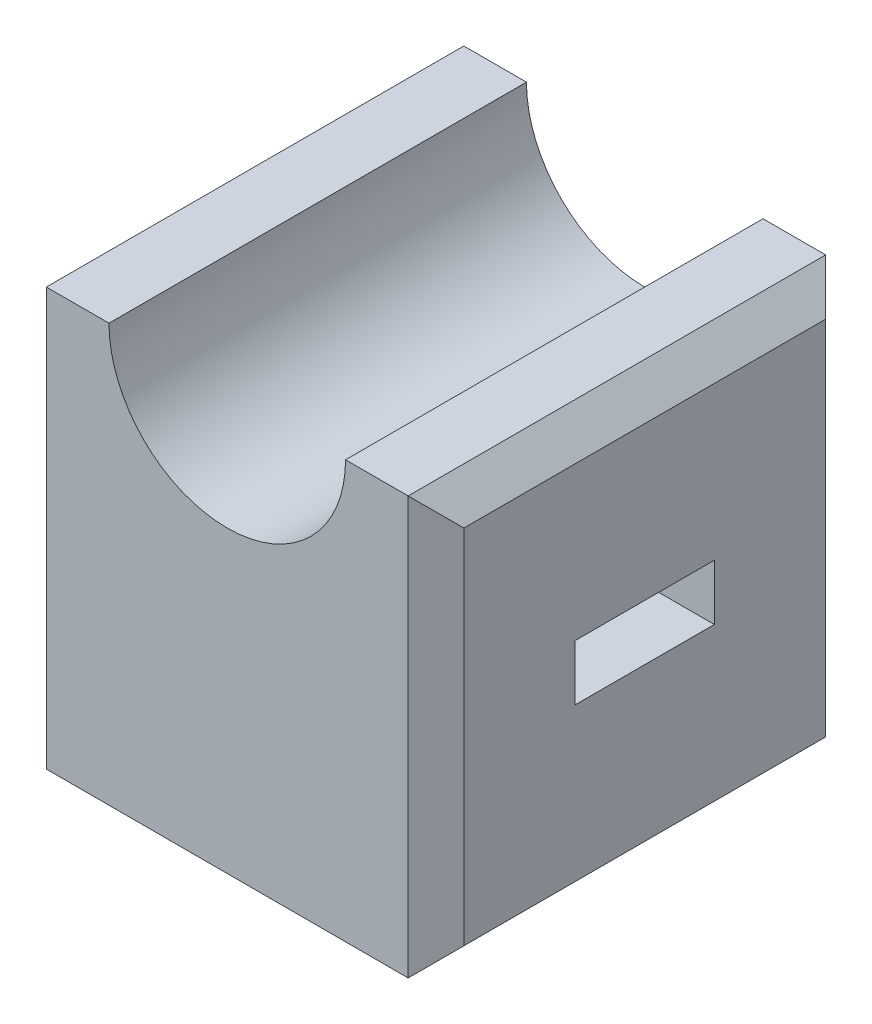
ISO-10303-21;
HEADER;
FILE_DESCRIPTION(('STEP AP214'),'2;1');
FILE_NAME('part.step','',(''),(''),'','','');
FILE_SCHEMA(('AUTOMOTIVE_DESIGN { 1 0 10303 214 1 1 1 1 }'));
ENDSEC;
DATA;
#1=APPLICATION_CONTEXT('core data for automotive mechanical design processes');
#2=APPLICATION_PROTOCOL_DEFINITION('international standard','automotive_design',2000,#1);
#3=PRODUCT_CONTEXT('',#1,'mechanical');
#4=PRODUCT('Part','Part','',(#3));
#5=PRODUCT_RELATED_PRODUCT_CATEGORY('part','',(#4));
#6=PRODUCT_DEFINITION_FORMATION('','',#4);
#7=PRODUCT_DEFINITION_CONTEXT('part definition',#1,'design');
#8=PRODUCT_DEFINITION('design','',#6,#7);
#9=PRODUCT_DEFINITION_SHAPE('','',#8);
#10=(LENGTH_UNIT() NAMED_UNIT(*) SI_UNIT(.MILLI.,.METRE.));
#11=(NAMED_UNIT(*) PLANE_ANGLE_UNIT() SI_UNIT($,.RADIAN.));
#12=(NAMED_UNIT(*) SI_UNIT($,.STERADIAN.) SOLID_ANGLE_UNIT());
#13=UNCERTAINTY_MEASURE_WITH_UNIT(LENGTH_MEASURE(1.E-05),#10,'distance_accuracy_value','');
#14=(GEOMETRIC_REPRESENTATION_CONTEXT(3) GLOBAL_UNCERTAINTY_ASSIGNED_CONTEXT((#13)) GLOBAL_UNIT_ASSIGNED_CONTEXT((#10,
#11,#12)) REPRESENTATION_CONTEXT('',''));
#15=CARTESIAN_POINT('',(0.,0.,0.));
#16=DIRECTION('',(0.,0.,1.));
#17=DIRECTION('',(1.,0.,0.));
#18=AXIS2_PLACEMENT_3D('',#15,#16,#17);
#19=CARTESIAN_POINT('',(15.,-15.,30.));
#20=DIRECTION('',(-1.,0.,0.));
#21=DIRECTION('',(0.,0.,1.));
#22=AXIS2_PLACEMENT_3D('',#19,#20,#21);
#23=PLANE('',#22);
#24=DIRECTION('',(0.,0.,1.));
#25=VECTOR('',#24,1.);
#26=CARTESIAN_POINT('',(15.,2.,20.));
#27=LINE('',#26,#25);
#28=CARTESIAN_POINT('',(15.,2.,10.));
#29=VERTEX_POINT('',#28);
#30=CARTESIAN_POINT('',(15.,2.,20.));
#31=VERTEX_POINT('',#30);
#32=EDGE_CURVE('E173',#29,#31,#27,.T.);
#33=ORIENTED_EDGE('',*,*,#32,.F.);
#34=DIRECTION('',(0.,1.,0.));
#35=VECTOR('',#34,1.);
#36=CARTESIAN_POINT('',(15.,-2.,10.));
#37=LINE('',#36,#35);
#38=CARTESIAN_POINT('',(15.,-2.,10.));
#39=VERTEX_POINT('',#38);
#40=EDGE_CURVE('E146',#39,#29,#37,.T.);
#41=ORIENTED_EDGE('',*,*,#40,.F.);
#42=DIRECTION('',(0.,0.,-1.));
#43=VECTOR('',#42,1.);
#44=CARTESIAN_POINT('',(15.,-2.,20.));
#45=LINE('',#44,#43);
#46=CARTESIAN_POINT('',(15.,-2.,20.));
#47=VERTEX_POINT('',#46);
#48=EDGE_CURVE('E164',#47,#39,#45,.T.);
#49=ORIENTED_EDGE('',*,*,#48,.F.);
#50=DIRECTION('',(0.,-1.,0.));
#51=VECTOR('',#50,1.);
#52=CARTESIAN_POINT('',(15.,-2.,20.));
#53=LINE('',#52,#51);
#54=EDGE_CURVE('E167',#31,#47,#53,.T.);
#55=ORIENTED_EDGE('',*,*,#54,.F.);
#56=EDGE_LOOP('',(#33,#41,#49,#55));
#57=FACE_BOUND('',#56,.T.);
#58=DIRECTION('',(0.,0.,1.));
#59=VECTOR('',#58,1.);
#60=CARTESIAN_POINT('',(15.,13.,30.));
#61=LINE('',#60,#59);
#62=CARTESIAN_POINT('',(15.,13.,2.00000000000001));
#63=VERTEX_POINT('',#62);
#64=CARTESIAN_POINT('',(15.,13.,28.));
#65=VERTEX_POINT('',#64);
#66=EDGE_CURVE('E211',#63,#65,#61,.T.);
#67=ORIENTED_EDGE('',*,*,#66,.T.);
#68=DIRECTION('',(0.,-1.,0.));
#69=VECTOR('',#68,1.);
#70=CARTESIAN_POINT('',(15.,-15.,28.));
#71=LINE('',#70,#69);
#72=CARTESIAN_POINT('',(15.,-13.,28.));
#73=VERTEX_POINT('',#72);
#74=EDGE_CURVE('E59',#65,#73,#71,.T.);
#75=ORIENTED_EDGE('',*,*,#74,.T.);
#76=DIRECTION('',(0.,0.,-1.));
#77=VECTOR('',#76,1.);
#78=CARTESIAN_POINT('',(15.,-13.,30.));
#79=LINE('',#78,#77);
#80=CARTESIAN_POINT('',(15.,-13.,2.00000000000001));
#81=VERTEX_POINT('',#80);
#82=EDGE_CURVE('E228',#73,#81,#79,.T.);
#83=ORIENTED_EDGE('',*,*,#82,.T.);
#84=DIRECTION('',(0.,1.,0.));
#85=VECTOR('',#84,1.);
#86=CARTESIAN_POINT('',(15.,13.,2.00000000000001));
#87=LINE('',#86,#85);
#88=EDGE_CURVE('E257',#81,#63,#87,.T.);
#89=ORIENTED_EDGE('',*,*,#88,.T.);
#90=EDGE_LOOP('',(#67,#75,#83,#89));
#91=FACE_BOUND('',#90,.T.);
#92=ADVANCED_FACE('F37',(#57,#91),#23,.F.);
#93=CARTESIAN_POINT('',(8.5,15.,30.));
#94=DIRECTION('',(0.,-1.,0.));
#95=DIRECTION('',(0.,0.,-1.));
#96=AXIS2_PLACEMENT_3D('',#93,#94,#95);
#97=PLANE('',#96);
#98=DIRECTION('',(-1.,0.,0.));
#99=VECTOR('',#98,1.);
#100=CARTESIAN_POINT('',(8.5,15.,30.));
#101=LINE('',#100,#99);
#102=CARTESIAN_POINT('',(13.,15.,30.));
#103=VERTEX_POINT('',#102);
#104=CARTESIAN_POINT('',(8.5,15.,30.));
#105=VERTEX_POINT('',#104);
#106=EDGE_CURVE('E183',#103,#105,#101,.T.);
#107=ORIENTED_EDGE('',*,*,#106,.F.);
#108=DIRECTION('',(0.,0.,-1.));
#109=VECTOR('',#108,1.);
#110=CARTESIAN_POINT('',(13.,15.,30.));
#111=LINE('',#110,#109);
#112=CARTESIAN_POINT('',(13.,15.,0.));
#113=VERTEX_POINT('',#112);
#114=EDGE_CURVE('E208',#103,#113,#111,.T.);
#115=ORIENTED_EDGE('',*,*,#114,.T.);
#116=DIRECTION('',(-1.,0.,0.));
#117=VECTOR('',#116,1.);
#118=CARTESIAN_POINT('',(8.5,15.,0.));
#119=LINE('',#118,#117);
#120=CARTESIAN_POINT('',(8.5,15.,0.));
#121=VERTEX_POINT('',#120);
#122=EDGE_CURVE('E179',#113,#121,#119,.T.);
#123=ORIENTED_EDGE('',*,*,#122,.T.);
#124=DIRECTION('',(0.,0.,-1.));
#125=VECTOR('',#124,1.);
#126=CARTESIAN_POINT('',(8.5,15.,30.));
#127=LINE('',#126,#125);
#128=EDGE_CURVE('E205',#105,#121,#127,.T.);
#129=ORIENTED_EDGE('',*,*,#128,.F.);
#130=EDGE_LOOP('',(#107,#115,#123,#129));
#131=FACE_BOUND('',#130,.T.);
#132=ADVANCED_FACE('F276',(#131),#97,.F.);
#133=CARTESIAN_POINT('',(0.,15.,30.));
#134=DIRECTION('',(0.,0.,-1.));
#135=DIRECTION('',(-1.,0.,0.));
#136=AXIS2_PLACEMENT_3D('',#133,#134,#135);
#137=CYLINDRICAL_SURFACE('',#136,8.5);
#138=CARTESIAN_POINT('',(0.,15.,0.));
#139=DIRECTION('',(0.,0.,-1.));
#140=DIRECTION('',(-1.,0.,0.));
#141=AXIS2_PLACEMENT_3D('',#138,#139,#140);
#142=CIRCLE('',#141,8.5);
#143=CARTESIAN_POINT('',(-8.5,15.,0.));
#144=VERTEX_POINT('',#143);
#145=EDGE_CURVE('E196',#121,#144,#142,.T.);
#146=ORIENTED_EDGE('',*,*,#145,.T.);
#147=DIRECTION('',(0.,0.,-1.));
#148=VECTOR('',#147,1.);
#149=CARTESIAN_POINT('',(-8.5,15.,30.));
#150=LINE('',#149,#148);
#151=CARTESIAN_POINT('',(-8.5,15.,30.));
#152=VERTEX_POINT('',#151);
#153=EDGE_CURVE('E194',#152,#144,#150,.T.);
#154=ORIENTED_EDGE('',*,*,#153,.F.);
#155=CARTESIAN_POINT('',(0.,15.,30.));
#156=DIRECTION('',(0.,0.,-1.));
#157=DIRECTION('',(-1.,0.,0.));
#158=AXIS2_PLACEMENT_3D('',#155,#156,#157);
#159=CIRCLE('',#158,8.5);
#160=EDGE_CURVE('E185',#105,#152,#159,.T.);
#161=ORIENTED_EDGE('',*,*,#160,.F.);
#162=ORIENTED_EDGE('',*,*,#128,.T.);
#163=EDGE_LOOP('',(#146,#154,#161,#162));
#164=FACE_BOUND('',#163,.T.);
#165=ADVANCED_FACE('F282',(#164),#137,.F.);
#166=CARTESIAN_POINT('',(-15.,15.,30.));
#167=DIRECTION('',(0.,-1.,0.));
#168=DIRECTION('',(0.,0.,-1.));
#169=AXIS2_PLACEMENT_3D('',#166,#167,#168);
#170=PLANE('',#169);
#171=DIRECTION('',(-1.,0.,0.));
#172=VECTOR('',#171,1.);
#173=CARTESIAN_POINT('',(-15.,15.,0.));
#174=LINE('',#173,#172);
#175=CARTESIAN_POINT('',(-13.,15.,0.));
#176=VERTEX_POINT('',#175);
#177=EDGE_CURVE('E198',#144,#176,#174,.T.);
#178=ORIENTED_EDGE('',*,*,#177,.T.);
#179=DIRECTION('',(0.,0.,1.));
#180=VECTOR('',#179,1.);
#181=CARTESIAN_POINT('',(-13.,15.,30.));
#182=LINE('',#181,#180);
#183=CARTESIAN_POINT('',(-13.,15.,30.));
#184=VERTEX_POINT('',#183);
#185=EDGE_CURVE('E216',#176,#184,#182,.T.);
#186=ORIENTED_EDGE('',*,*,#185,.T.);
#187=DIRECTION('',(-1.,0.,0.));
#188=VECTOR('',#187,1.);
#189=CARTESIAN_POINT('',(-15.,15.,30.));
#190=LINE('',#189,#188);
#191=EDGE_CURVE('E188',#152,#184,#190,.T.);
#192=ORIENTED_EDGE('',*,*,#191,.F.);
#193=ORIENTED_EDGE('',*,*,#153,.T.);
#194=EDGE_LOOP('',(#178,#186,#192,#193));
#195=FACE_BOUND('',#194,.T.);
#196=ADVANCED_FACE('F459',(#195),#170,.F.);
#197=CARTESIAN_POINT('',(-15.,-15.,30.));
#198=DIRECTION('',(1.,0.,0.));
#199=DIRECTION('',(0.,0.,-1.));
#200=AXIS2_PLACEMENT_3D('',#197,#198,#199);
#201=PLANE('',#200);
#202=DIRECTION('',(0.,0.,-1.));
#203=VECTOR('',#202,1.);
#204=CARTESIAN_POINT('',(-15.,-2.,20.));
#205=LINE('',#204,#203);
#206=CARTESIAN_POINT('',(-15.,-2.,20.));
#207=VERTEX_POINT('',#206);
#208=CARTESIAN_POINT('',(-15.,-2.,10.));
#209=VERTEX_POINT('',#208);
#210=EDGE_CURVE('E151',#207,#209,#205,.T.);
#211=ORIENTED_EDGE('',*,*,#210,.T.);
#212=DIRECTION('',(0.,1.,0.));
#213=VECTOR('',#212,1.);
#214=CARTESIAN_POINT('',(-15.,-2.,10.));
#215=LINE('',#214,#213);
#216=CARTESIAN_POINT('',(-15.,2.,10.));
#217=VERTEX_POINT('',#216);
#218=EDGE_CURVE('E143',#209,#217,#215,.T.);
#219=ORIENTED_EDGE('',*,*,#218,.T.);
#220=DIRECTION('',(0.,0.,1.));
#221=VECTOR('',#220,1.);
#222=CARTESIAN_POINT('',(-15.,2.,20.));
#223=LINE('',#222,#221);
#224=CARTESIAN_POINT('',(-15.,2.,20.));
#225=VERTEX_POINT('',#224);
#226=EDGE_CURVE('E155',#217,#225,#223,.T.);
#227=ORIENTED_EDGE('',*,*,#226,.T.);
#228=DIRECTION('',(0.,-1.,0.));
#229=VECTOR('',#228,1.);
#230=CARTESIAN_POINT('',(-15.,-2.,20.));
#231=LINE('',#230,#229);
#232=EDGE_CURVE('E159',#225,#207,#231,.T.);
#233=ORIENTED_EDGE('',*,*,#232,.T.);
#234=EDGE_LOOP('',(#211,#219,#227,#233));
#235=FACE_BOUND('',#234,.T.);
#236=DIRECTION('',(0.,0.,-1.));
#237=VECTOR('',#236,1.);
#238=CARTESIAN_POINT('',(-15.,13.,30.));
#239=LINE('',#238,#237);
#240=CARTESIAN_POINT('',(-15.,13.,28.));
#241=VERTEX_POINT('',#240);
#242=CARTESIAN_POINT('',(-15.,13.,2.00000000000001));
#243=VERTEX_POINT('',#242);
#244=EDGE_CURVE('E213',#241,#243,#239,.T.);
#245=ORIENTED_EDGE('',*,*,#244,.T.);
#246=DIRECTION('',(0.,-1.,0.));
#247=VECTOR('',#246,1.);
#248=CARTESIAN_POINT('',(-15.,-13.,2.00000000000001));
#249=LINE('',#248,#247);
#250=CARTESIAN_POINT('',(-15.,-13.,2.00000000000001));
#251=VERTEX_POINT('',#250);
#252=EDGE_CURVE('E232',#243,#251,#249,.T.);
#253=ORIENTED_EDGE('',*,*,#252,.T.);
#254=DIRECTION('',(0.,0.,1.));
#255=VECTOR('',#254,1.);
#256=CARTESIAN_POINT('',(-15.,-13.,30.));
#257=LINE('',#256,#255);
#258=CARTESIAN_POINT('',(-15.,-13.,28.));
#259=VERTEX_POINT('',#258);
#260=EDGE_CURVE('E225',#251,#259,#257,.T.);
#261=ORIENTED_EDGE('',*,*,#260,.T.);
#262=DIRECTION('',(0.,1.,0.));
#263=VECTOR('',#262,1.);
#264=CARTESIAN_POINT('',(-15.,-15.,28.));
#265=LINE('',#264,#263);
#266=EDGE_CURVE('E230',#259,#241,#265,.T.);
#267=ORIENTED_EDGE('',*,*,#266,.T.);
#268=EDGE_LOOP('',(#245,#253,#261,#267));
#269=FACE_BOUND('',#268,.T.);
#270=ADVANCED_FACE('F161',(#235,#269),#201,.F.);
#271=CARTESIAN_POINT('',(-15.,-15.,30.));
#272=DIRECTION('',(0.,1.,0.));
#273=DIRECTION('',(0.,0.,1.));
#274=AXIS2_PLACEMENT_3D('',#271,#272,#273);
#275=PLANE('',#274);
#276=DIRECTION('',(1.,0.,0.));
#277=VECTOR('',#276,1.);
#278=CARTESIAN_POINT('',(-15.,-15.,30.));
#279=LINE('',#278,#277);
#280=CARTESIAN_POINT('',(-13.,-15.,30.));
#281=VERTEX_POINT('',#280);
#282=CARTESIAN_POINT('',(13.,-15.,30.));
#283=VERTEX_POINT('',#282);
#284=EDGE_CURVE('E191',#281,#283,#279,.T.);
#285=ORIENTED_EDGE('',*,*,#284,.F.);
#286=DIRECTION('',(0.,0.,-1.));
#287=VECTOR('',#286,1.);
#288=CARTESIAN_POINT('',(-13.,-15.,30.));
#289=LINE('',#288,#287);
#290=CARTESIAN_POINT('',(-13.,-15.,0.));
#291=VERTEX_POINT('',#290);
#292=EDGE_CURVE('E222',#281,#291,#289,.T.);
#293=ORIENTED_EDGE('',*,*,#292,.T.);
#294=DIRECTION('',(1.,0.,0.));
#295=VECTOR('',#294,1.);
#296=CARTESIAN_POINT('',(-15.,-15.,0.));
#297=LINE('',#296,#295);
#298=CARTESIAN_POINT('',(13.,-15.,0.));
#299=VERTEX_POINT('',#298);
#300=EDGE_CURVE('E186',#291,#299,#297,.T.);
#301=ORIENTED_EDGE('',*,*,#300,.T.);
#302=DIRECTION('',(0.,0.,1.));
#303=VECTOR('',#302,1.);
#304=CARTESIAN_POINT('',(13.,-15.,30.));
#305=LINE('',#304,#303);
#306=EDGE_CURVE('E219',#299,#283,#305,.T.);
#307=ORIENTED_EDGE('',*,*,#306,.T.);
#308=EDGE_LOOP('',(#285,#293,#301,#307));
#309=FACE_BOUND('',#308,.T.);
#310=ADVANCED_FACE('F302',(#309),#275,.F.);
#311=CARTESIAN_POINT('',(0.,15.,30.));
#312=DIRECTION('',(0.,0.,-1.));
#313=DIRECTION('',(-1.,0.,0.));
#314=AXIS2_PLACEMENT_3D('',#311,#312,#313);
#315=PLANE('',#314);
#316=ORIENTED_EDGE('',*,*,#191,.T.);
#317=DIRECTION('',(0.,-1.,0.));
#318=VECTOR('',#317,1.);
#319=CARTESIAN_POINT('',(-13.,15.,30.));
#320=LINE('',#319,#318);
#321=EDGE_CURVE('E250',#184,#281,#320,.T.);
#322=ORIENTED_EDGE('',*,*,#321,.T.);
#323=ORIENTED_EDGE('',*,*,#284,.T.);
#324=DIRECTION('',(0.,1.,0.));
#325=VECTOR('',#324,1.);
#326=CARTESIAN_POINT('',(13.,15.,30.));
#327=LINE('',#326,#325);
#328=EDGE_CURVE('E247',#283,#103,#327,.T.);
#329=ORIENTED_EDGE('',*,*,#328,.T.);
#330=ORIENTED_EDGE('',*,*,#106,.T.);
#331=ORIENTED_EDGE('',*,*,#160,.T.);
#332=EDGE_LOOP('',(#316,#322,#323,#329,#330,#331));
#333=FACE_BOUND('',#332,.T.);
#334=ADVANCED_FACE('F272',(#333),#315,.F.);
#335=CARTESIAN_POINT('',(0.,15.,0.));
#336=DIRECTION('',(0.,0.,-1.));
#337=DIRECTION('',(-1.,0.,0.));
#338=AXIS2_PLACEMENT_3D('',#335,#336,#337);
#339=PLANE('',#338);
#340=ORIENTED_EDGE('',*,*,#300,.F.);
#341=DIRECTION('',(0.,1.,0.));
#342=VECTOR('',#341,1.);
#343=CARTESIAN_POINT('',(-13.,13.,0.));
#344=LINE('',#343,#342);
#345=EDGE_CURVE('E241',#291,#176,#344,.T.);
#346=ORIENTED_EDGE('',*,*,#345,.T.);
#347=ORIENTED_EDGE('',*,*,#177,.F.);
#348=ORIENTED_EDGE('',*,*,#145,.F.);
#349=ORIENTED_EDGE('',*,*,#122,.F.);
#350=DIRECTION('',(0.,-1.,0.));
#351=VECTOR('',#350,1.);
#352=CARTESIAN_POINT('',(13.,-13.,0.));
#353=LINE('',#352,#351);
#354=EDGE_CURVE('E239',#113,#299,#353,.T.);
#355=ORIENTED_EDGE('',*,*,#354,.T.);
#356=EDGE_LOOP('',(#340,#346,#347,#348,#349,#355));
#357=FACE_BOUND('',#356,.T.);
#358=ADVANCED_FACE('F304',(#357),#339,.T.);
#359=CARTESIAN_POINT('',(-15.,-2.,10.));
#360=DIRECTION('',(0.,0.,-1.));
#361=DIRECTION('',(-1.,0.,0.));
#362=AXIS2_PLACEMENT_3D('',#359,#360,#361);
#363=PLANE('',#362);
#364=ORIENTED_EDGE('',*,*,#40,.T.);
#365=DIRECTION('',(1.,0.,0.));
#366=VECTOR('',#365,1.);
#367=CARTESIAN_POINT('',(-15.,2.,10.));
#368=LINE('',#367,#366);
#369=EDGE_CURVE('E139',#217,#29,#368,.T.);
#370=ORIENTED_EDGE('',*,*,#369,.F.);
#371=ORIENTED_EDGE('',*,*,#218,.F.);
#372=DIRECTION('',(1.,0.,0.));
#373=VECTOR('',#372,1.);
#374=CARTESIAN_POINT('',(-15.,-2.,10.));
#375=LINE('',#374,#373);
#376=EDGE_CURVE('E177',#209,#39,#375,.T.);
#377=ORIENTED_EDGE('',*,*,#376,.T.);
#378=EDGE_LOOP('',(#364,#370,#371,#377));
#379=FACE_BOUND('',#378,.T.);
#380=ADVANCED_FACE('F141',(#379),#363,.F.);
#381=CARTESIAN_POINT('',(-15.,-2.,20.));
#382=DIRECTION('',(0.,-1.,0.));
#383=DIRECTION('',(0.,0.,-1.));
#384=AXIS2_PLACEMENT_3D('',#381,#382,#383);
#385=PLANE('',#384);
#386=ORIENTED_EDGE('',*,*,#48,.T.);
#387=ORIENTED_EDGE('',*,*,#376,.F.);
#388=ORIENTED_EDGE('',*,*,#210,.F.);
#389=DIRECTION('',(1.,0.,0.));
#390=VECTOR('',#389,1.);
#391=CARTESIAN_POINT('',(-15.,-2.,20.));
#392=LINE('',#391,#390);
#393=EDGE_CURVE('E180',#207,#47,#392,.T.);
#394=ORIENTED_EDGE('',*,*,#393,.T.);
#395=EDGE_LOOP('',(#386,#387,#388,#394));
#396=FACE_BOUND('',#395,.T.);
#397=ADVANCED_FACE('F414',(#396),#385,.F.);
#398=CARTESIAN_POINT('',(-15.,-2.,20.));
#399=DIRECTION('',(0.,0.,1.));
#400=DIRECTION('',(1.,0.,0.));
#401=AXIS2_PLACEMENT_3D('',#398,#399,#400);
#402=PLANE('',#401);
#403=ORIENTED_EDGE('',*,*,#54,.T.);
#404=ORIENTED_EDGE('',*,*,#393,.F.);
#405=ORIENTED_EDGE('',*,*,#232,.F.);
#406=DIRECTION('',(1.,0.,0.));
#407=VECTOR('',#406,1.);
#408=CARTESIAN_POINT('',(-15.,2.,20.));
#409=LINE('',#408,#407);
#410=EDGE_CURVE('E150',#225,#31,#409,.T.);
#411=ORIENTED_EDGE('',*,*,#410,.T.);
#412=EDGE_LOOP('',(#403,#404,#405,#411));
#413=FACE_BOUND('',#412,.T.);
#414=ADVANCED_FACE('F406',(#413),#402,.F.);
#415=CARTESIAN_POINT('',(-15.,2.,20.));
#416=DIRECTION('',(0.,1.,0.));
#417=DIRECTION('',(0.,0.,1.));
#418=AXIS2_PLACEMENT_3D('',#415,#416,#417);
#419=PLANE('',#418);
#420=ORIENTED_EDGE('',*,*,#32,.T.);
#421=ORIENTED_EDGE('',*,*,#410,.F.);
#422=ORIENTED_EDGE('',*,*,#226,.F.);
#423=ORIENTED_EDGE('',*,*,#369,.T.);
#424=EDGE_LOOP('',(#420,#421,#422,#423));
#425=FACE_BOUND('',#424,.T.);
#426=ADVANCED_FACE('F156',(#425),#419,.F.);
#427=CARTESIAN_POINT('',(13.,15.,30.));
#428=DIRECTION('',(-0.707106781186549,-0.707106781186546,0.));
#429=DIRECTION('',(0.,0.,-1.));
#430=AXIS2_PLACEMENT_3D('',#427,#428,#429);
#431=PLANE('',#430);
#432=ORIENTED_EDGE('',*,*,#114,.F.);
#433=DIRECTION('',(0.577350269189624,-0.577350269189627,-0.577350269189626));
#434=VECTOR('',#433,1.);
#435=CARTESIAN_POINT('',(13.,15.,30.));
#436=LINE('',#435,#434);
#437=EDGE_CURVE('E255',#103,#65,#436,.T.);
#438=ORIENTED_EDGE('',*,*,#437,.T.);
#439=ORIENTED_EDGE('',*,*,#66,.F.);
#440=DIRECTION('',(0.577350269189626,-0.577350269189628,0.577350269189624));
#441=VECTOR('',#440,1.);
#442=CARTESIAN_POINT('',(22.9999999999999,5.,9.99999999999993));
#443=LINE('',#442,#441);
#444=EDGE_CURVE('E253',#63,#113,#443,.F.);
#445=ORIENTED_EDGE('',*,*,#444,.T.);
#446=EDGE_LOOP('',(#432,#438,#439,#445));
#447=FACE_BOUND('',#446,.T.);
#448=ADVANCED_FACE('F265',(#447),#431,.F.);
#449=CARTESIAN_POINT('',(-15.,13.,30.));
#450=DIRECTION('',(0.707106781186547,-0.707106781186548,0.));
#451=DIRECTION('',(0.,0.,-1.));
#452=AXIS2_PLACEMENT_3D('',#449,#450,#451);
#453=PLANE('',#452);
#454=ORIENTED_EDGE('',*,*,#185,.F.);
#455=DIRECTION('',(0.577350269189627,0.577350269189625,-0.577350269189625));
#456=VECTOR('',#455,1.);
#457=CARTESIAN_POINT('',(-24.3333333333333,3.66666666666668,11.3333333333333));
#458=LINE('',#457,#456);
#459=EDGE_CURVE('E245',#176,#243,#458,.F.);
#460=ORIENTED_EDGE('',*,*,#459,.T.);
#461=ORIENTED_EDGE('',*,*,#244,.F.);
#462=DIRECTION('',(0.577350269189626,0.577350269189624,0.577350269189628));
#463=VECTOR('',#462,1.);
#464=CARTESIAN_POINT('',(-14.3333333333333,13.6666666666667,28.6666666666667));
#465=LINE('',#464,#463);
#466=EDGE_CURVE('E243',#241,#184,#465,.T.);
#467=ORIENTED_EDGE('',*,*,#466,.T.);
#468=EDGE_LOOP('',(#454,#460,#461,#467));
#469=FACE_BOUND('',#468,.T.);
#470=ADVANCED_FACE('F326',(#469),#453,.F.);
#471=CARTESIAN_POINT('',(-13.,-15.,30.));
#472=DIRECTION('',(0.707106781186549,0.707106781186546,0.));
#473=DIRECTION('',(0.,0.,-1.));
#474=AXIS2_PLACEMENT_3D('',#471,#472,#473);
#475=PLANE('',#474);
#476=ORIENTED_EDGE('',*,*,#260,.F.);
#477=DIRECTION('',(-0.577350269189626,0.577350269189628,0.577350269189624));
#478=VECTOR('',#477,1.);
#479=CARTESIAN_POINT('',(-23.,-5.,9.99999999999994));
#480=LINE('',#479,#478);
#481=EDGE_CURVE('E237',#251,#291,#480,.F.);
#482=ORIENTED_EDGE('',*,*,#481,.T.);
#483=ORIENTED_EDGE('',*,*,#292,.F.);
#484=DIRECTION('',(-0.577350269189624,0.577350269189626,-0.577350269189626));
#485=VECTOR('',#484,1.);
#486=CARTESIAN_POINT('',(-13.,-15.,30.));
#487=LINE('',#486,#485);
#488=EDGE_CURVE('E235',#281,#259,#487,.T.);
#489=ORIENTED_EDGE('',*,*,#488,.T.);
#490=EDGE_LOOP('',(#476,#482,#483,#489));
#491=FACE_BOUND('',#490,.T.);
#492=ADVANCED_FACE('F293',(#491),#475,.F.);
#493=CARTESIAN_POINT('',(15.,-13.,30.));
#494=DIRECTION('',(-0.707106781186546,0.707106781186549,0.));
#495=DIRECTION('',(0.,0.,-1.));
#496=AXIS2_PLACEMENT_3D('',#493,#494,#495);
#497=PLANE('',#496);
#498=ORIENTED_EDGE('',*,*,#82,.F.);
#499=DIRECTION('',(-0.577350269189626,-0.577350269189624,0.577350269189628));
#500=VECTOR('',#499,1.);
#501=CARTESIAN_POINT('',(14.3333333333333,-13.6666666666667,28.6666666666667));
#502=LINE('',#501,#500);
#503=EDGE_CURVE('E11',#73,#283,#502,.T.);
#504=ORIENTED_EDGE('',*,*,#503,.T.);
#505=ORIENTED_EDGE('',*,*,#306,.F.);
#506=DIRECTION('',(-0.577350269189627,-0.577350269189625,-0.577350269189625));
#507=VECTOR('',#506,1.);
#508=CARTESIAN_POINT('',(24.3333333333333,-3.66666666666668,11.3333333333333));
#509=LINE('',#508,#507);
#510=EDGE_CURVE('E46',#299,#81,#509,.F.);
#511=ORIENTED_EDGE('',*,*,#510,.T.);
#512=EDGE_LOOP('',(#498,#504,#505,#511));
#513=FACE_BOUND('',#512,.T.);
#514=ADVANCED_FACE('F338',(#513),#497,.F.);
#515=CARTESIAN_POINT('',(-15.,-15.,2.00000000000001));
#516=DIRECTION('',(-0.707106781186546,0.,-0.707106781186549));
#517=DIRECTION('',(0.,1.,0.));
#518=AXIS2_PLACEMENT_3D('',#515,#516,#517);
#519=PLANE('',#518);
#520=ORIENTED_EDGE('',*,*,#459,.F.);
#521=ORIENTED_EDGE('',*,*,#345,.F.);
#522=ORIENTED_EDGE('',*,*,#481,.F.);
#523=ORIENTED_EDGE('',*,*,#252,.F.);
#524=EDGE_LOOP('',(#520,#521,#522,#523));
#525=FACE_BOUND('',#524,.T.);
#526=ADVANCED_FACE('F298',(#525),#519,.T.);
#527=CARTESIAN_POINT('',(-13.,15.,30.));
#528=DIRECTION('',(0.707106781186549,0.,-0.707106781186546));
#529=DIRECTION('',(0.,-1.,0.));
#530=AXIS2_PLACEMENT_3D('',#527,#528,#529);
#531=PLANE('',#530);
#532=ORIENTED_EDGE('',*,*,#466,.F.);
#533=ORIENTED_EDGE('',*,*,#266,.F.);
#534=ORIENTED_EDGE('',*,*,#488,.F.);
#535=ORIENTED_EDGE('',*,*,#321,.F.);
#536=EDGE_LOOP('',(#532,#533,#534,#535));
#537=FACE_BOUND('',#536,.T.);
#538=ADVANCED_FACE('F288',(#537),#531,.F.);
#539=CARTESIAN_POINT('',(13.,15.,30.));
#540=DIRECTION('',(-0.707106781186549,0.,-0.707106781186546));
#541=DIRECTION('',(0.,1.,0.));
#542=AXIS2_PLACEMENT_3D('',#539,#540,#541);
#543=PLANE('',#542);
#544=ORIENTED_EDGE('',*,*,#503,.F.);
#545=ORIENTED_EDGE('',*,*,#74,.F.);
#546=ORIENTED_EDGE('',*,*,#437,.F.);
#547=ORIENTED_EDGE('',*,*,#328,.F.);
#548=EDGE_LOOP('',(#544,#545,#546,#547));
#549=FACE_BOUND('',#548,.T.);
#550=ADVANCED_FACE('F269',(#549),#543,.F.);
#551=CARTESIAN_POINT('',(15.,-15.,2.00000000000001));
#552=DIRECTION('',(0.707106781186546,0.,-0.707106781186549));
#553=DIRECTION('',(0.,-1.,0.));
#554=AXIS2_PLACEMENT_3D('',#551,#552,#553);
#555=PLANE('',#554);
#556=ORIENTED_EDGE('',*,*,#510,.F.);
#557=ORIENTED_EDGE('',*,*,#354,.F.);
#558=ORIENTED_EDGE('',*,*,#444,.F.);
#559=ORIENTED_EDGE('',*,*,#88,.F.);
#560=EDGE_LOOP('',(#556,#557,#558,#559));
#561=FACE_BOUND('',#560,.T.);
#562=ADVANCED_FACE('F40',(#561),#555,.T.);
#563=CLOSED_SHELL('',(#92,#132,#165,#196,#270,#310,#334,#358,#380,#397,#414,#426,#448,#470,#492,
#514,#526,#538,#550,#562));
#564=MANIFOLD_SOLID_BREP('B2',#563);
#565=ADVANCED_BREP_SHAPE_REPRESENTATION('',(#18,#564),#14);
#566=SHAPE_DEFINITION_REPRESENTATION(#9,#565);
ENDSEC;
END-ISO-10303-21;
